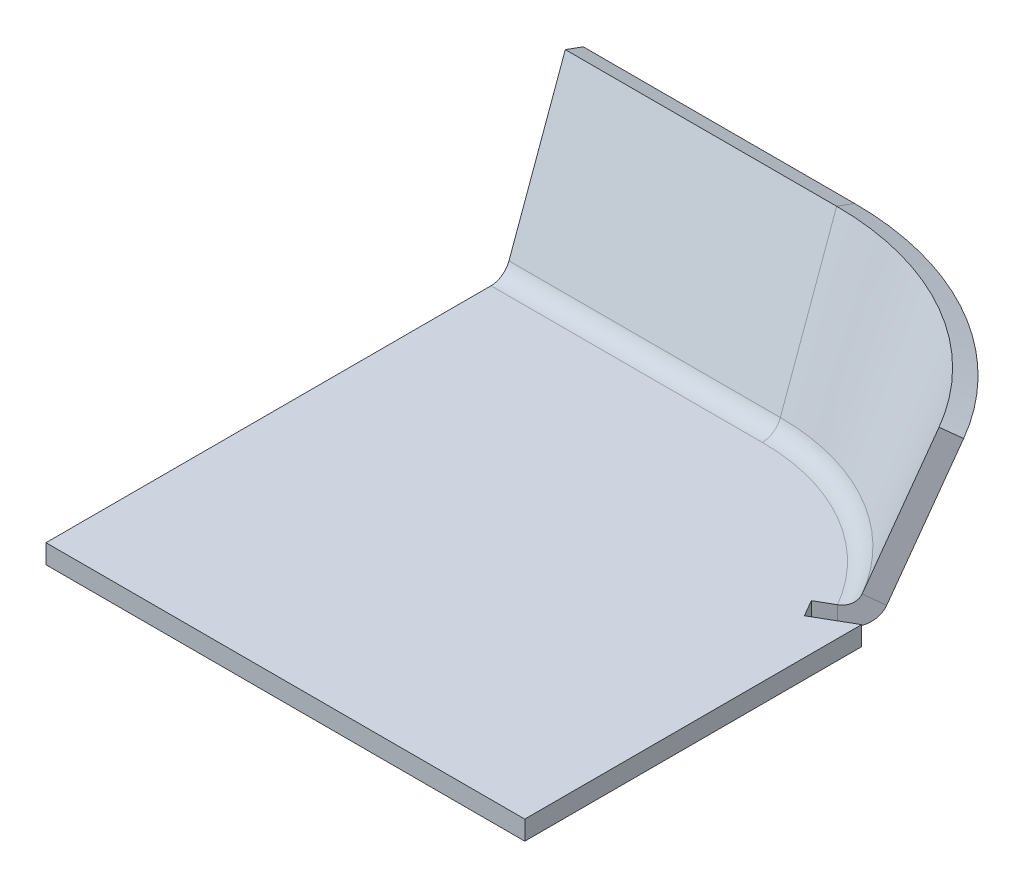
ISO-10303-21;
HEADER;
FILE_DESCRIPTION(('STEP AP214'),'2;1');
FILE_NAME('part.step','',(''),(''),'','','');
FILE_SCHEMA(('AUTOMOTIVE_DESIGN { 1 0 10303 214 1 1 1 1 }'));
ENDSEC;
DATA;
#1=APPLICATION_CONTEXT('core data for automotive mechanical design processes');
#2=APPLICATION_PROTOCOL_DEFINITION('international standard','automotive_design',2000,#1);
#3=PRODUCT_CONTEXT('',#1,'mechanical');
#4=PRODUCT('Part','Part','',(#3));
#5=PRODUCT_RELATED_PRODUCT_CATEGORY('part','',(#4));
#6=PRODUCT_DEFINITION_FORMATION('','',#4);
#7=PRODUCT_DEFINITION_CONTEXT('part definition',#1,'design');
#8=PRODUCT_DEFINITION('design','',#6,#7);
#9=PRODUCT_DEFINITION_SHAPE('','',#8);
#10=(LENGTH_UNIT() NAMED_UNIT(*) SI_UNIT(.MILLI.,.METRE.));
#11=(NAMED_UNIT(*) PLANE_ANGLE_UNIT() SI_UNIT($,.RADIAN.));
#12=(NAMED_UNIT(*) SI_UNIT($,.STERADIAN.) SOLID_ANGLE_UNIT());
#13=UNCERTAINTY_MEASURE_WITH_UNIT(LENGTH_MEASURE(1.E-05),#10,'distance_accuracy_value','');
#14=(GEOMETRIC_REPRESENTATION_CONTEXT(3) GLOBAL_UNCERTAINTY_ASSIGNED_CONTEXT((#13)) GLOBAL_UNIT_ASSIGNED_CONTEXT((#10,
#11,#12)) REPRESENTATION_CONTEXT('',''));
#15=CARTESIAN_POINT('',(0.,0.,0.));
#16=DIRECTION('',(0.,0.,1.));
#17=DIRECTION('',(1.,0.,0.));
#18=AXIS2_PLACEMENT_3D('',#15,#16,#17);
#19=CARTESIAN_POINT('',(0.,-2.,0.));
#20=DIRECTION('',(-1.,0.,0.));
#21=DIRECTION('',(0.,0.,1.));
#22=AXIS2_PLACEMENT_3D('',#19,#20,#21);
#23=PLANE('',#22);
#24=DIRECTION('',(0.,1.,0.));
#25=VECTOR('',#24,1.);
#26=CARTESIAN_POINT('',(0.,0.,-46.4712293786288));
#27=LINE('',#26,#25);
#28=CARTESIAN_POINT('',(0.,-2.,-46.4712293786288));
#29=VERTEX_POINT('',#28);
#30=CARTESIAN_POINT('',(0.,0.,-46.4712293786288));
#31=VERTEX_POINT('',#30);
#32=EDGE_CURVE('E233',#29,#31,#27,.T.);
#33=ORIENTED_EDGE('',*,*,#32,.F.);
#34=DIRECTION('',(0.,0.,1.));
#35=VECTOR('',#34,1.);
#36=CARTESIAN_POINT('',(0.,-2.,0.));
#37=LINE('',#36,#35);
#38=CARTESIAN_POINT('',(0.,-2.,0.));
#39=VERTEX_POINT('',#38);
#40=EDGE_CURVE('E171',#29,#39,#37,.T.);
#41=ORIENTED_EDGE('',*,*,#40,.T.);
#42=DIRECTION('',(0.,1.,0.));
#43=VECTOR('',#42,1.);
#44=CARTESIAN_POINT('',(0.,-2.,0.));
#45=LINE('',#44,#43);
#46=CARTESIAN_POINT('',(0.,0.,0.));
#47=VERTEX_POINT('',#46);
#48=EDGE_CURVE('E123',#39,#47,#45,.T.);
#49=ORIENTED_EDGE('',*,*,#48,.T.);
#50=DIRECTION('',(0.,0.,1.));
#51=VECTOR('',#50,1.);
#52=CARTESIAN_POINT('',(0.,0.,0.));
#53=LINE('',#52,#51);
#54=EDGE_CURVE('E176',#31,#47,#53,.T.);
#55=ORIENTED_EDGE('',*,*,#54,.F.);
#56=EDGE_LOOP('',(#33,#41,#49,#55));
#57=FACE_BOUND('',#56,.T.);
#58=ADVANCED_FACE('F120',(#57),#23,.T.);
#59=CARTESIAN_POINT('',(50.,-2.,-37.4860956618465));
#60=DIRECTION('',(1.,0.,0.));
#61=DIRECTION('',(0.,0.,-1.));
#62=AXIS2_PLACEMENT_3D('',#59,#60,#61);
#63=PLANE('',#62);
#64=DIRECTION('',(0.,-1.,0.));
#65=VECTOR('',#64,1.);
#66=CARTESIAN_POINT('',(50.,0.,-35.177549918585));
#67=LINE('',#66,#65);
#68=CARTESIAN_POINT('',(50.,0.,-35.177549918585));
#69=VERTEX_POINT('',#68);
#70=CARTESIAN_POINT('',(50.,-2.,-35.177549918585));
#71=VERTEX_POINT('',#70);
#72=EDGE_CURVE('E167',#69,#71,#67,.T.);
#73=ORIENTED_EDGE('',*,*,#72,.F.);
#74=DIRECTION('',(0.,0.,-1.));
#75=VECTOR('',#74,1.);
#76=CARTESIAN_POINT('',(50.,0.,-37.4860956618465));
#77=LINE('',#76,#75);
#78=CARTESIAN_POINT('',(50.,0.,0.));
#79=VERTEX_POINT('',#78);
#80=EDGE_CURVE('E163',#79,#69,#77,.T.);
#81=ORIENTED_EDGE('',*,*,#80,.F.);
#82=DIRECTION('',(0.,1.,0.));
#83=VECTOR('',#82,1.);
#84=CARTESIAN_POINT('',(50.,-2.,0.));
#85=LINE('',#84,#83);
#86=CARTESIAN_POINT('',(50.,-2.,0.));
#87=VERTEX_POINT('',#86);
#88=EDGE_CURVE('E12',#87,#79,#85,.T.);
#89=ORIENTED_EDGE('',*,*,#88,.F.);
#90=DIRECTION('',(0.,0.,-1.));
#91=VECTOR('',#90,1.);
#92=CARTESIAN_POINT('',(50.,-2.,-37.4860956618465));
#93=LINE('',#92,#91);
#94=EDGE_CURVE('E184',#87,#71,#93,.T.);
#95=ORIENTED_EDGE('',*,*,#94,.T.);
#96=EDGE_LOOP('',(#73,#81,#89,#95));
#97=FACE_BOUND('',#96,.T.);
#98=ADVANCED_FACE('F164',(#97),#63,.T.);
#99=CARTESIAN_POINT('',(0.,-2.,0.));
#100=DIRECTION('',(0.,0.,1.));
#101=DIRECTION('',(1.,0.,0.));
#102=AXIS2_PLACEMENT_3D('',#99,#100,#101);
#103=PLANE('',#102);
#104=DIRECTION('',(1.,0.,0.));
#105=VECTOR('',#104,1.);
#106=CARTESIAN_POINT('',(0.,0.,0.));
#107=LINE('',#106,#105);
#108=EDGE_CURVE('E158',#47,#79,#107,.T.);
#109=ORIENTED_EDGE('',*,*,#108,.F.);
#110=ORIENTED_EDGE('',*,*,#48,.F.);
#111=DIRECTION('',(1.,0.,0.));
#112=VECTOR('',#111,1.);
#113=CARTESIAN_POINT('',(0.,-2.,0.));
#114=LINE('',#113,#112);
#115=EDGE_CURVE('E160',#39,#87,#114,.T.);
#116=ORIENTED_EDGE('',*,*,#115,.T.);
#117=ORIENTED_EDGE('',*,*,#88,.T.);
#118=EDGE_LOOP('',(#109,#110,#116,#117));
#119=FACE_BOUND('',#118,.T.);
#120=ADVANCED_FACE('F155',(#119),#103,.T.);
#121=CARTESIAN_POINT('',(28.3413431828468,-2.,-25.));
#122=DIRECTION('',(0.,-1.,0.));
#123=DIRECTION('',(0.,0.,-1.));
#124=AXIS2_PLACEMENT_3D('',#121,#122,#123);
#125=PLANE('',#124);
#126=DIRECTION('',(-0.866346272686129,0.,0.49944382647386));
#127=VECTOR('',#126,1.);
#128=CARTESIAN_POINT('',(29.3402308357945,-2.,-23.2673074546277));
#129=LINE('',#128,#127);
#130=CARTESIAN_POINT('',(46.2090578325862,-2.,-32.9920927616403));
#131=VERTEX_POINT('',#130);
#132=EDGE_CURVE('E181',#71,#131,#129,.T.);
#133=ORIENTED_EDGE('',*,*,#132,.F.);
#134=ORIENTED_EDGE('',*,*,#94,.F.);
#135=ORIENTED_EDGE('',*,*,#115,.F.);
#136=ORIENTED_EDGE('',*,*,#40,.F.);
#137=DIRECTION('',(-1.,0.,0.));
#138=VECTOR('',#137,1.);
#139=CARTESIAN_POINT('',(28.3413431828468,-2.,-46.4712293786288));
#140=LINE('',#139,#138);
#141=CARTESIAN_POINT('',(28.3413431828468,-2.,-46.4712293786288));
#142=VERTEX_POINT('',#141);
#143=EDGE_CURVE('E261',#142,#29,#140,.T.);
#144=ORIENTED_EDGE('',*,*,#143,.F.);
#145=CARTESIAN_POINT('',(28.3413431828468,-2.,-25.));
#146=DIRECTION('',(0.,1.,0.));
#147=DIRECTION('',(0.,0.,1.));
#148=AXIS2_PLACEMENT_3D('',#145,#146,#147);
#149=CIRCLE('',#148,21.4712293786288);
#150=CARTESIAN_POINT('',(46.9428627250107,-2.,-35.7236729599603));
#151=VERTEX_POINT('',#150);
#152=EDGE_CURVE('E266',#151,#142,#149,.T.);
#153=ORIENTED_EDGE('',*,*,#152,.F.);
#154=DIRECTION('',(0.86634627268613,0.,-0.499443826473859));
#155=VECTOR('',#154,1.);
#156=CARTESIAN_POINT('',(28.3413431828468,-2.,-25.));
#157=LINE('',#156,#155);
#158=CARTESIAN_POINT('',(45.2101701796384,-2.,-34.7247853070126));
#159=VERTEX_POINT('',#158);
#160=EDGE_CURVE('E198',#159,#151,#157,.T.);
#161=ORIENTED_EDGE('',*,*,#160,.F.);
#162=DIRECTION('',(-0.499443826473859,0.,-0.86634627268613));
#163=VECTOR('',#162,1.);
#164=CARTESIAN_POINT('',(45.2101701796384,-2.,-34.7247853070126));
#165=LINE('',#164,#163);
#166=EDGE_CURVE('E194',#131,#159,#165,.T.);
#167=ORIENTED_EDGE('',*,*,#166,.F.);
#168=EDGE_LOOP('',(#133,#134,#135,#136,#144,#153,#161,#167));
#169=FACE_BOUND('',#168,.T.);
#170=ADVANCED_FACE('F419',(#169),#125,.T.);
#171=CARTESIAN_POINT('',(28.3413431828468,0.,-25.));
#172=DIRECTION('',(0.,-1.,0.));
#173=DIRECTION('',(0.,0.,-1.));
#174=AXIS2_PLACEMENT_3D('',#171,#172,#173);
#175=PLANE('',#174);
#176=ORIENTED_EDGE('',*,*,#80,.T.);
#177=DIRECTION('',(-0.866346272686129,0.,0.49944382647386));
#178=VECTOR('',#177,1.);
#179=CARTESIAN_POINT('',(50.,0.,-35.177549918585));
#180=LINE('',#179,#178);
#181=CARTESIAN_POINT('',(46.2090578325862,0.,-32.9920927616403));
#182=VERTEX_POINT('',#181);
#183=EDGE_CURVE('E202',#69,#182,#180,.T.);
#184=ORIENTED_EDGE('',*,*,#183,.T.);
#185=DIRECTION('',(-0.499443826473859,0.,-0.866346272686129));
#186=VECTOR('',#185,1.);
#187=CARTESIAN_POINT('',(46.2090578325862,0.,-32.9920927616403));
#188=LINE('',#187,#186);
#189=CARTESIAN_POINT('',(45.2101701796384,0.,-34.7247853070126));
#190=VERTEX_POINT('',#189);
#191=EDGE_CURVE('E205',#182,#190,#188,.T.);
#192=ORIENTED_EDGE('',*,*,#191,.T.);
#193=DIRECTION('',(0.866346272686129,0.,-0.499443826473859));
#194=VECTOR('',#193,1.);
#195=CARTESIAN_POINT('',(45.2101701796384,0.,-34.7247853070126));
#196=LINE('',#195,#194);
#197=CARTESIAN_POINT('',(46.9428627250107,0.,-35.7236729599603));
#198=VERTEX_POINT('',#197);
#199=EDGE_CURVE('E210',#190,#198,#196,.T.);
#200=ORIENTED_EDGE('',*,*,#199,.T.);
#201=CARTESIAN_POINT('',(28.3413431828468,0.,-25.));
#202=DIRECTION('',(0.,1.,0.));
#203=DIRECTION('',(0.866346272686129,0.,-0.49944382647386));
#204=AXIS2_PLACEMENT_3D('',#201,#202,#203);
#205=CIRCLE('',#204,21.4712293786288);
#206=CARTESIAN_POINT('',(28.3413431828468,0.,-46.4712293786288));
#207=VERTEX_POINT('',#206);
#208=EDGE_CURVE('E322',#198,#207,#205,.T.);
#209=ORIENTED_EDGE('',*,*,#208,.T.);
#210=DIRECTION('',(-1.,0.,0.));
#211=VECTOR('',#210,1.);
#212=CARTESIAN_POINT('',(28.3413431828468,0.,-46.4712293786288));
#213=LINE('',#212,#211);
#214=EDGE_CURVE('E312',#207,#31,#213,.T.);
#215=ORIENTED_EDGE('',*,*,#214,.T.);
#216=ORIENTED_EDGE('',*,*,#54,.T.);
#217=ORIENTED_EDGE('',*,*,#108,.T.);
#218=EDGE_LOOP('',(#176,#184,#192,#200,#209,#215,#216,#217));
#219=FACE_BOUND('',#218,.T.);
#220=ADVANCED_FACE('F173',(#219),#175,.F.);
#221=CARTESIAN_POINT('',(50.,0.,-35.177549918585));
#222=DIRECTION('',(0.49944382647386,0.,0.866346272686129));
#223=DIRECTION('',(0.866346272686129,0.,-0.49944382647386));
#224=AXIS2_PLACEMENT_3D('',#221,#222,#223);
#225=PLANE('',#224);
#226=ORIENTED_EDGE('',*,*,#72,.T.);
#227=ORIENTED_EDGE('',*,*,#132,.T.);
#228=DIRECTION('',(0.,-1.,0.));
#229=VECTOR('',#228,1.);
#230=CARTESIAN_POINT('',(46.2090578325862,0.,-32.9920927616403));
#231=LINE('',#230,#229);
#232=EDGE_CURVE('E206',#182,#131,#231,.T.);
#233=ORIENTED_EDGE('',*,*,#232,.F.);
#234=ORIENTED_EDGE('',*,*,#183,.F.);
#235=EDGE_LOOP('',(#226,#227,#233,#234));
#236=FACE_BOUND('',#235,.T.);
#237=ADVANCED_FACE('F415',(#236),#225,.F.);
#238=CARTESIAN_POINT('',(46.2090578325862,0.,-32.9920927616403));
#239=DIRECTION('',(-0.866346272686129,0.,0.499443826473859));
#240=DIRECTION('',(0.499443826473859,0.,0.86634627268613));
#241=AXIS2_PLACEMENT_3D('',#238,#239,#240);
#242=PLANE('',#241);
#243=ORIENTED_EDGE('',*,*,#232,.T.);
#244=ORIENTED_EDGE('',*,*,#166,.T.);
#245=DIRECTION('',(0.,-1.,0.));
#246=VECTOR('',#245,1.);
#247=CARTESIAN_POINT('',(45.2101701796384,0.,-34.7247853070126));
#248=LINE('',#247,#246);
#249=EDGE_CURVE('E211',#190,#159,#248,.T.);
#250=ORIENTED_EDGE('',*,*,#249,.F.);
#251=ORIENTED_EDGE('',*,*,#191,.F.);
#252=EDGE_LOOP('',(#243,#244,#250,#251));
#253=FACE_BOUND('',#252,.T.);
#254=ADVANCED_FACE('F424',(#253),#242,.F.);
#255=CARTESIAN_POINT('',(45.2101701796384,0.,-34.7247853070126));
#256=DIRECTION('',(-0.499443826473859,0.,-0.866346272686129));
#257=DIRECTION('',(-0.86634627268613,0.,0.499443826473859));
#258=AXIS2_PLACEMENT_3D('',#255,#256,#257);
#259=PLANE('',#258);
#260=ORIENTED_EDGE('',*,*,#249,.T.);
#261=ORIENTED_EDGE('',*,*,#160,.T.);
#262=DIRECTION('',(0.,1.,0.));
#263=VECTOR('',#262,1.);
#264=CARTESIAN_POINT('',(46.9428627250107,0.,-35.7236729599603));
#265=LINE('',#264,#263);
#266=EDGE_CURVE('E236',#151,#198,#265,.T.);
#267=ORIENTED_EDGE('',*,*,#266,.T.);
#268=ORIENTED_EDGE('',*,*,#199,.F.);
#269=EDGE_LOOP('',(#260,#261,#267,#268));
#270=FACE_BOUND('',#269,.T.);
#271=ADVANCED_FACE('F426',(#270),#259,.F.);
#272=CARTESIAN_POINT('',(0.,2.,-46.4712293786288));
#273=DIRECTION('',(1.,0.,0.));
#274=DIRECTION('',(0.,0.,-1.));
#275=AXIS2_PLACEMENT_3D('',#272,#273,#274);
#276=PLANE('',#275);
#277=DIRECTION('',(0.,0.342020143325672,0.939692620785907));
#278=VECTOR('',#277,1.);
#279=CARTESIAN_POINT('',(0.,1.31595971334865,-48.3506146202006));
#280=LINE('',#279,#278);
#281=CARTESIAN_POINT('',(0.,0.631919426697309,-50.2299998617724));
#282=VERTEX_POINT('',#281);
#283=CARTESIAN_POINT('',(0.,1.31595971334865,-48.3506146202006));
#284=VERTEX_POINT('',#283);
#285=EDGE_CURVE('E215',#282,#284,#280,.T.);
#286=ORIENTED_EDGE('',*,*,#285,.F.);
#287=CARTESIAN_POINT('',(0.,2.,-46.4712293786288));
#288=DIRECTION('',(-1.,0.,0.));
#289=DIRECTION('',(0.,0.,1.));
#290=AXIS2_PLACEMENT_3D('',#287,#288,#289);
#291=CIRCLE('',#290,4.);
#292=EDGE_CURVE('E257',#29,#282,#291,.F.);
#293=ORIENTED_EDGE('',*,*,#292,.F.);
#294=ORIENTED_EDGE('',*,*,#32,.T.);
#295=CARTESIAN_POINT('',(0.,2.,-46.4712293786288));
#296=DIRECTION('',(-1.,0.,0.));
#297=DIRECTION('',(0.,0.,1.));
#298=AXIS2_PLACEMENT_3D('',#295,#296,#297);
#299=CIRCLE('',#298,2.);
#300=EDGE_CURVE('E135',#31,#284,#299,.F.);
#301=ORIENTED_EDGE('',*,*,#300,.T.);
#302=EDGE_LOOP('',(#286,#293,#294,#301));
#303=FACE_BOUND('',#302,.T.);
#304=ADVANCED_FACE('F441',(#303),#276,.F.);
#305=CARTESIAN_POINT('',(46.9428627250107,2.,-35.7236729599603));
#306=DIRECTION('',(0.49944382647386,0.,0.866346272686129));
#307=DIRECTION('',(0.86634627268613,0.,-0.49944382647386));
#308=AXIS2_PLACEMENT_3D('',#305,#306,#307);
#309=PLANE('',#308);
#310=ORIENTED_EDGE('',*,*,#266,.F.);
#311=CARTESIAN_POINT('',(46.9428627250107,2.,-35.7236729599603));
#312=DIRECTION('',(0.49944382647386,0.,0.866346272686129));
#313=DIRECTION('',(0.866346272686129,0.,-0.49944382647386));
#314=AXIS2_PLACEMENT_3D('',#311,#312,#313);
#315=CIRCLE('',#314,4.);
#316=CARTESIAN_POINT('',(50.1992595229648,0.631919426697313,-37.6009676728985));
#317=VERTEX_POINT('',#316);
#318=EDGE_CURVE('E272',#151,#317,#315,.T.);
#319=ORIENTED_EDGE('',*,*,#318,.T.);
#320=DIRECTION('',(-0.814099199488531,0.342020143325673,0.469323678234563));
#321=VECTOR('',#320,1.);
#322=CARTESIAN_POINT('',(48.5710611239878,1.31595971334865,-36.6623203164294));
#323=LINE('',#322,#321);
#324=CARTESIAN_POINT('',(48.5710611239878,1.31595971334865,-36.6623203164294));
#325=VERTEX_POINT('',#324);
#326=EDGE_CURVE('E240',#317,#325,#323,.T.);
#327=ORIENTED_EDGE('',*,*,#326,.T.);
#328=CARTESIAN_POINT('',(46.9428627250107,2.,-35.7236729599603));
#329=DIRECTION('',(-0.49944382647386,0.,-0.866346272686129));
#330=DIRECTION('',(-0.866346272686129,0.,0.49944382647386));
#331=AXIS2_PLACEMENT_3D('',#328,#329,#330);
#332=CIRCLE('',#331,2.);
#333=EDGE_CURVE('E286',#198,#325,#332,.F.);
#334=ORIENTED_EDGE('',*,*,#333,.F.);
#335=EDGE_LOOP('',(#310,#319,#327,#334));
#336=FACE_BOUND('',#335,.T.);
#337=ADVANCED_FACE('F462',(#336),#309,.T.);
#338=CARTESIAN_POINT('',(48.1561071066801,0.,-36.4231016243789));
#339=DIRECTION('',(-0.49944382647386,0.,-0.866346272686129));
#340=DIRECTION('',(0.296307876353772,0.939692620785907,-0.170819849113712));
#341=AXIS2_PLACEMENT_3D('',#338,#339,#340);
#342=PLANE('',#341);
#343=ORIENTED_EDGE('',*,*,#326,.F.);
#344=DIRECTION('',(0.296307876353772,0.939692620785907,-0.170819849113712));
#345=VECTOR('',#344,1.);
#346=CARTESIAN_POINT('',(50.1992595229648,0.631919426697309,-37.6009676728986));
#347=LINE('',#346,#345);
#348=CARTESIAN_POINT('',(55.295509015425,16.7938524157181,-40.5389272710717));
#349=VERTEX_POINT('',#348);
#350=EDGE_CURVE('E271',#317,#349,#347,.T.);
#351=ORIENTED_EDGE('',*,*,#350,.T.);
#352=DIRECTION('',(-0.814099199488531,0.342020143325673,0.469323678234563));
#353=VECTOR('',#352,1.);
#354=CARTESIAN_POINT('',(53.6673106164479,17.4778927023695,-39.6002799146026));
#355=LINE('',#354,#353);
#356=CARTESIAN_POINT('',(53.6673106164479,17.4778927023695,-39.6002799146026));
#357=VERTEX_POINT('',#356);
#358=EDGE_CURVE('E244',#349,#357,#355,.T.);
#359=ORIENTED_EDGE('',*,*,#358,.T.);
#360=DIRECTION('',(0.296307876353772,0.939692620785907,-0.170819849113712));
#361=VECTOR('',#360,1.);
#362=CARTESIAN_POINT('',(48.1561071066801,0.,-36.4231016243789));
#363=LINE('',#362,#361);
#364=EDGE_CURVE('E318',#325,#357,#363,.T.);
#365=ORIENTED_EDGE('',*,*,#364,.F.);
#366=EDGE_LOOP('',(#343,#351,#359,#365));
#367=FACE_BOUND('',#366,.T.);
#368=ADVANCED_FACE('F357',(#367),#342,.F.);
#369=CARTESIAN_POINT('',(28.3413431828468,17.4778927023695,-25.));
#370=DIRECTION('',(0.,-1.,0.));
#371=DIRECTION('',(0.,0.,-1.));
#372=AXIS2_PLACEMENT_3D('',#369,#370,#371);
#373=CONICAL_SURFACE('',#372,29.2330771564092,1.22173047639603);
#374=ORIENTED_EDGE('',*,*,#358,.F.);
#375=CARTESIAN_POINT('',(28.3413431828468,16.7938524157181,-25.));
#376=DIRECTION('',(0.,1.,0.));
#377=DIRECTION('',(0.,0.,1.));
#378=AXIS2_PLACEMENT_3D('',#375,#376,#377);
#379=CIRCLE('',#378,31.112462397981);
#380=CARTESIAN_POINT('',(28.3413431828468,16.7938524157181,-56.112462397981));
#381=VERTEX_POINT('',#380);
#382=EDGE_CURVE('E265',#349,#381,#379,.T.);
#383=ORIENTED_EDGE('',*,*,#382,.T.);
#384=DIRECTION('',(0.,0.342020143325673,0.939692620785907));
#385=VECTOR('',#384,1.);
#386=CARTESIAN_POINT('',(28.3413431828468,17.4778927023695,-54.2330771564092));
#387=LINE('',#386,#385);
#388=CARTESIAN_POINT('',(28.3413431828468,17.4778927023695,-54.2330771564092));
#389=VERTEX_POINT('',#388);
#390=EDGE_CURVE('E228',#381,#389,#387,.T.);
#391=ORIENTED_EDGE('',*,*,#390,.T.);
#392=CARTESIAN_POINT('',(28.3413431828468,17.4778927023695,-25.));
#393=DIRECTION('',(0.,1.,0.));
#394=DIRECTION('',(0.866346272686129,0.,-0.49944382647386));
#395=AXIS2_PLACEMENT_3D('',#392,#393,#394);
#396=CIRCLE('',#395,29.2330771564092);
#397=EDGE_CURVE('E308',#357,#389,#396,.T.);
#398=ORIENTED_EDGE('',*,*,#397,.F.);
#399=EDGE_LOOP('',(#374,#383,#391,#398));
#400=FACE_BOUND('',#399,.T.);
#401=ADVANCED_FACE('F451',(#400),#373,.T.);
#402=CARTESIAN_POINT('',(28.3413431828468,17.4778927023695,-54.2330771564092));
#403=DIRECTION('',(0.,0.939692620785907,-0.342020143325673));
#404=DIRECTION('',(-1.,0.,0.));
#405=AXIS2_PLACEMENT_3D('',#402,#403,#404);
#406=PLANE('',#405);
#407=ORIENTED_EDGE('',*,*,#390,.F.);
#408=DIRECTION('',(1.,0.,0.));
#409=VECTOR('',#408,1.);
#410=CARTESIAN_POINT('',(28.3413431828468,16.7938524157181,-56.112462397981));
#411=LINE('',#410,#409);
#412=CARTESIAN_POINT('',(0.,16.7938524157181,-56.112462397981));
#413=VERTEX_POINT('',#412);
#414=EDGE_CURVE('E255',#381,#413,#411,.F.);
#415=ORIENTED_EDGE('',*,*,#414,.T.);
#416=DIRECTION('',(0.,0.342020143325673,0.939692620785907));
#417=VECTOR('',#416,1.);
#418=CARTESIAN_POINT('',(0.,17.4778927023695,-54.2330771564092));
#419=LINE('',#418,#417);
#420=CARTESIAN_POINT('',(0.,17.4778927023695,-54.2330771564092));
#421=VERTEX_POINT('',#420);
#422=EDGE_CURVE('E224',#413,#421,#419,.T.);
#423=ORIENTED_EDGE('',*,*,#422,.T.);
#424=DIRECTION('',(-1.,0.,0.));
#425=VECTOR('',#424,1.);
#426=CARTESIAN_POINT('',(28.3413431828468,17.4778927023695,-54.2330771564092));
#427=LINE('',#426,#425);
#428=EDGE_CURVE('E229',#389,#421,#427,.T.);
#429=ORIENTED_EDGE('',*,*,#428,.F.);
#430=EDGE_LOOP('',(#407,#415,#423,#429));
#431=FACE_BOUND('',#430,.T.);
#432=ADVANCED_FACE('F453',(#431),#406,.T.);
#433=CARTESIAN_POINT('',(0.,0.,-47.8716444550482));
#434=DIRECTION('',(1.,0.,0.));
#435=DIRECTION('',(0.,0.939692620785907,-0.342020143325673));
#436=AXIS2_PLACEMENT_3D('',#433,#434,#435);
#437=PLANE('',#436);
#438=DIRECTION('',(0.,-0.939692620785907,0.342020143325673));
#439=VECTOR('',#438,1.);
#440=CARTESIAN_POINT('',(0.,-0.684040286651345,-49.75102969662));
#441=LINE('',#440,#439);
#442=EDGE_CURVE('E251',#282,#413,#441,.F.);
#443=ORIENTED_EDGE('',*,*,#442,.F.);
#444=ORIENTED_EDGE('',*,*,#285,.T.);
#445=DIRECTION('',(0.,0.939692620785907,-0.342020143325673));
#446=VECTOR('',#445,1.);
#447=CARTESIAN_POINT('',(0.,0.,-47.8716444550482));
#448=LINE('',#447,#446);
#449=EDGE_CURVE('E303',#284,#421,#448,.T.);
#450=ORIENTED_EDGE('',*,*,#449,.T.);
#451=ORIENTED_EDGE('',*,*,#422,.F.);
#452=EDGE_LOOP('',(#443,#444,#450,#451));
#453=FACE_BOUND('',#452,.T.);
#454=ADVANCED_FACE('F459',(#453),#437,.F.);
#455=CARTESIAN_POINT('',(28.3413431828468,0.,-47.8716444550482));
#456=DIRECTION('',(0.,0.342020143325673,0.939692620785907));
#457=DIRECTION('',(0.,-0.939692620785907,0.342020143325673));
#458=AXIS2_PLACEMENT_3D('',#455,#456,#457);
#459=PLANE('',#458);
#460=ORIENTED_EDGE('',*,*,#428,.T.);
#461=ORIENTED_EDGE('',*,*,#449,.F.);
#462=DIRECTION('',(-1.,0.,0.));
#463=VECTOR('',#462,1.);
#464=CARTESIAN_POINT('',(28.3413431828468,1.31595971334865,-48.3506146202006));
#465=LINE('',#464,#463);
#466=CARTESIAN_POINT('',(28.3413431828468,1.31595971334865,-48.3506146202006));
#467=VERTEX_POINT('',#466);
#468=EDGE_CURVE('E307',#467,#284,#465,.T.);
#469=ORIENTED_EDGE('',*,*,#468,.F.);
#470=DIRECTION('',(0.,0.939692620785907,-0.342020143325673));
#471=VECTOR('',#470,1.);
#472=CARTESIAN_POINT('',(28.3413431828468,0.,-47.8716444550482));
#473=LINE('',#472,#471);
#474=EDGE_CURVE('E313',#467,#389,#473,.T.);
#475=ORIENTED_EDGE('',*,*,#474,.T.);
#476=EDGE_LOOP('',(#460,#461,#469,#475));
#477=FACE_BOUND('',#476,.T.);
#478=ADVANCED_FACE('F371',(#477),#459,.T.);
#479=CARTESIAN_POINT('',(28.3413431828468,2.,-46.4712293786288));
#480=DIRECTION('',(-1.,0.,0.));
#481=DIRECTION('',(0.,0.,1.));
#482=AXIS2_PLACEMENT_3D('',#479,#480,#481);
#483=CYLINDRICAL_SURFACE('',#482,2.);
#484=ORIENTED_EDGE('',*,*,#468,.T.);
#485=ORIENTED_EDGE('',*,*,#300,.F.);
#486=ORIENTED_EDGE('',*,*,#214,.F.);
#487=CARTESIAN_POINT('',(28.3413431828468,2.,-46.4712293786288));
#488=DIRECTION('',(-1.,0.,0.));
#489=DIRECTION('',(0.,0.,1.));
#490=AXIS2_PLACEMENT_3D('',#487,#488,#489);
#491=CIRCLE('',#490,2.);
#492=EDGE_CURVE('E332',#207,#467,#491,.F.);
#493=ORIENTED_EDGE('',*,*,#492,.T.);
#494=EDGE_LOOP('',(#484,#485,#486,#493));
#495=FACE_BOUND('',#494,.T.);
#496=ADVANCED_FACE('F429',(#495),#483,.F.);
#497=CARTESIAN_POINT('',(28.3413431828468,1.31595971334865,-25.));
#498=DIRECTION('',(0.,1.,0.));
#499=DIRECTION('',(0.,0.,1.));
#500=AXIS2_PLACEMENT_3D('',#497,#498,#499);
#501=CONICAL_SURFACE('',#500,23.3506146202006,0.34906585039887);
#502=ORIENTED_EDGE('',*,*,#397,.T.);
#503=ORIENTED_EDGE('',*,*,#474,.F.);
#504=CARTESIAN_POINT('',(28.3413431828468,1.31595971334865,-25.));
#505=DIRECTION('',(0.,1.,0.));
#506=DIRECTION('',(0.866346272686129,0.,-0.49944382647386));
#507=AXIS2_PLACEMENT_3D('',#504,#505,#506);
#508=CIRCLE('',#507,23.3506146202006);
#509=EDGE_CURVE('E317',#325,#467,#508,.T.);
#510=ORIENTED_EDGE('',*,*,#509,.F.);
#511=ORIENTED_EDGE('',*,*,#364,.T.);
#512=EDGE_LOOP('',(#502,#503,#510,#511));
#513=FACE_BOUND('',#512,.T.);
#514=ADVANCED_FACE('F364',(#513),#501,.F.);
#515=CARTESIAN_POINT('',(28.3413431828468,2.,-25.));
#516=DIRECTION('',(0.,1.,0.));
#517=DIRECTION('',(0.,0.,1.));
#518=AXIS2_PLACEMENT_3D('',#515,#516,#517);
#519=TOROIDAL_SURFACE('',#518,21.4712293786288,2.);
#520=ORIENTED_EDGE('',*,*,#509,.T.);
#521=ORIENTED_EDGE('',*,*,#492,.F.);
#522=ORIENTED_EDGE('',*,*,#208,.F.);
#523=ORIENTED_EDGE('',*,*,#333,.T.);
#524=EDGE_LOOP('',(#520,#521,#522,#523));
#525=FACE_BOUND('',#524,.T.);
#526=ADVANCED_FACE('F346',(#525),#519,.F.);
#527=CARTESIAN_POINT('',(28.3413431828468,-0.684040286651345,-49.75102969662));
#528=DIRECTION('',(0.,0.342020143325673,0.939692620785907));
#529=DIRECTION('',(0.,-0.939692620785907,0.342020143325673));
#530=AXIS2_PLACEMENT_3D('',#527,#528,#529);
#531=PLANE('',#530);
#532=ORIENTED_EDGE('',*,*,#414,.F.);
#533=DIRECTION('',(0.,-0.939692620785907,0.342020143325673));
#534=VECTOR('',#533,1.);
#535=CARTESIAN_POINT('',(28.3413431828468,-0.684040286651345,-49.75102969662));
#536=LINE('',#535,#534);
#537=CARTESIAN_POINT('',(28.3413431828468,0.631919426697309,-50.2299998617724));
#538=VERTEX_POINT('',#537);
#539=EDGE_CURVE('E282',#538,#381,#536,.F.);
#540=ORIENTED_EDGE('',*,*,#539,.F.);
#541=DIRECTION('',(-1.,0.,0.));
#542=VECTOR('',#541,1.);
#543=CARTESIAN_POINT('',(28.3413431828468,0.63191942669731,-50.2299998617724));
#544=LINE('',#543,#542);
#545=EDGE_CURVE('E256',#538,#282,#544,.T.);
#546=ORIENTED_EDGE('',*,*,#545,.T.);
#547=ORIENTED_EDGE('',*,*,#442,.T.);
#548=EDGE_LOOP('',(#532,#540,#546,#547));
#549=FACE_BOUND('',#548,.T.);
#550=ADVANCED_FACE('F446',(#549),#531,.F.);
#551=CARTESIAN_POINT('',(28.3413431828468,2.,-46.4712293786288));
#552=DIRECTION('',(-1.,0.,0.));
#553=DIRECTION('',(0.,0.,1.));
#554=AXIS2_PLACEMENT_3D('',#551,#552,#553);
#555=CYLINDRICAL_SURFACE('',#554,4.);
#556=ORIENTED_EDGE('',*,*,#545,.F.);
#557=CARTESIAN_POINT('',(28.3413431828468,2.,-46.4712293786288));
#558=DIRECTION('',(-1.,0.,0.));
#559=DIRECTION('',(0.,0.,1.));
#560=AXIS2_PLACEMENT_3D('',#557,#558,#559);
#561=CIRCLE('',#560,4.);
#562=EDGE_CURVE('E270',#142,#538,#561,.F.);
#563=ORIENTED_EDGE('',*,*,#562,.F.);
#564=ORIENTED_EDGE('',*,*,#143,.T.);
#565=ORIENTED_EDGE('',*,*,#292,.T.);
#566=EDGE_LOOP('',(#556,#563,#564,#565));
#567=FACE_BOUND('',#566,.T.);
#568=ADVANCED_FACE('F438',(#567),#555,.T.);
#569=CARTESIAN_POINT('',(28.3413431828468,0.631919426697309,-25.));
#570=DIRECTION('',(0.,1.,0.));
#571=DIRECTION('',(0.,0.,1.));
#572=AXIS2_PLACEMENT_3D('',#569,#570,#571);
#573=CONICAL_SURFACE('',#572,25.2299998617724,0.34906585039887);
#574=ORIENTED_EDGE('',*,*,#382,.F.);
#575=ORIENTED_EDGE('',*,*,#350,.F.);
#576=CARTESIAN_POINT('',(28.3413431828468,0.631919426697315,-25.));
#577=DIRECTION('',(0.,1.,0.));
#578=DIRECTION('',(0.,0.,1.));
#579=AXIS2_PLACEMENT_3D('',#576,#577,#578);
#580=CIRCLE('',#579,25.2299998617724);
#581=EDGE_CURVE('E287',#317,#538,#580,.T.);
#582=ORIENTED_EDGE('',*,*,#581,.T.);
#583=ORIENTED_EDGE('',*,*,#539,.T.);
#584=EDGE_LOOP('',(#574,#575,#582,#583));
#585=FACE_BOUND('',#584,.T.);
#586=ADVANCED_FACE('F449',(#585),#573,.T.);
#587=CARTESIAN_POINT('',(28.3413431828468,2.,-25.));
#588=DIRECTION('',(0.,1.,0.));
#589=DIRECTION('',(0.,0.,1.));
#590=AXIS2_PLACEMENT_3D('',#587,#588,#589);
#591=TOROIDAL_SURFACE('',#590,21.4712293786288,4.);
#592=ORIENTED_EDGE('',*,*,#581,.F.);
#593=ORIENTED_EDGE('',*,*,#318,.F.);
#594=ORIENTED_EDGE('',*,*,#152,.T.);
#595=ORIENTED_EDGE('',*,*,#562,.T.);
#596=EDGE_LOOP('',(#592,#593,#594,#595));
#597=FACE_BOUND('',#596,.T.);
#598=ADVANCED_FACE('F492',(#597),#591,.T.);
#599=CLOSED_SHELL('',(#58,#98,#120,#170,#220,#237,#254,#271,#304,#337,#368,#401,#432,#454,#478,
#496,#514,#526,#550,#568,#586,#598));
#600=MANIFOLD_SOLID_BREP('B2',#599);
#601=ADVANCED_BREP_SHAPE_REPRESENTATION('',(#18,#600),#14);
#602=SHAPE_DEFINITION_REPRESENTATION(#9,#601);
ENDSEC;
END-ISO-10303-21;
